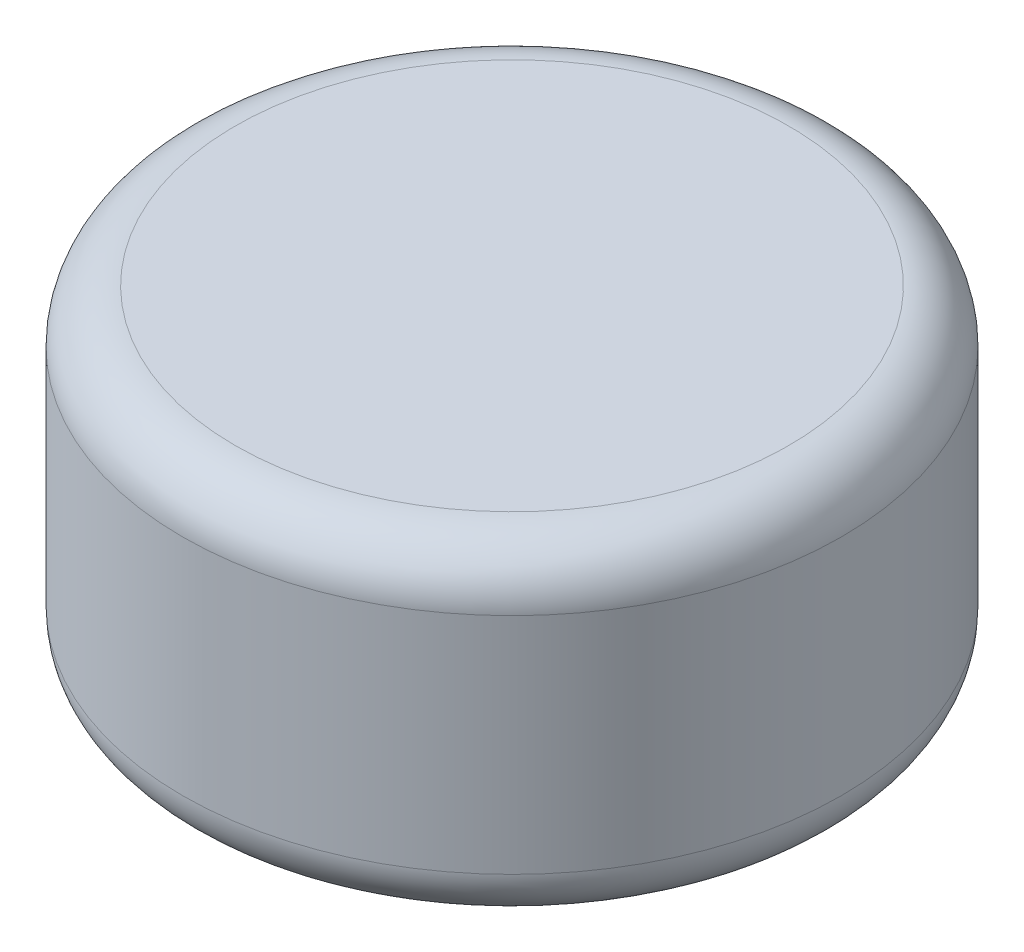
ISO-10303-21;
HEADER;
FILE_DESCRIPTION(('STEP AP214'),'2;1');
FILE_NAME('part.step','',(''),(''),'','','');
FILE_SCHEMA(('AUTOMOTIVE_DESIGN { 1 0 10303 214 1 1 1 1 }'));
ENDSEC;
DATA;
#1=APPLICATION_CONTEXT('core data for automotive mechanical design processes');
#2=APPLICATION_PROTOCOL_DEFINITION('international standard','automotive_design',2000,#1);
#3=PRODUCT_CONTEXT('',#1,'mechanical');
#4=PRODUCT('Part','Part','',(#3));
#5=PRODUCT_RELATED_PRODUCT_CATEGORY('part','',(#4));
#6=PRODUCT_DEFINITION_FORMATION('','',#4);
#7=PRODUCT_DEFINITION_CONTEXT('part definition',#1,'design');
#8=PRODUCT_DEFINITION('design','',#6,#7);
#9=PRODUCT_DEFINITION_SHAPE('','',#8);
#10=(LENGTH_UNIT() NAMED_UNIT(*) SI_UNIT(.MILLI.,.METRE.));
#11=(NAMED_UNIT(*) PLANE_ANGLE_UNIT() SI_UNIT($,.RADIAN.));
#12=(NAMED_UNIT(*) SI_UNIT($,.STERADIAN.) SOLID_ANGLE_UNIT());
#13=UNCERTAINTY_MEASURE_WITH_UNIT(LENGTH_MEASURE(1.E-05),#10,'distance_accuracy_value','');
#14=(GEOMETRIC_REPRESENTATION_CONTEXT(3) GLOBAL_UNCERTAINTY_ASSIGNED_CONTEXT((#13)) GLOBAL_UNIT_ASSIGNED_CONTEXT((#10,
#11,#12)) REPRESENTATION_CONTEXT('',''));
#15=CARTESIAN_POINT('',(0.,0.,0.));
#16=DIRECTION('',(0.,0.,1.));
#17=DIRECTION('',(1.,0.,0.));
#18=AXIS2_PLACEMENT_3D('',#15,#16,#17);
#19=CARTESIAN_POINT('',(0.,1.5875,0.));
#20=DIRECTION('',(0.,-1.,0.));
#21=DIRECTION('',(0.,0.,-1.));
#22=AXIS2_PLACEMENT_3D('',#19,#20,#21);
#23=CYLINDRICAL_SURFACE('',#22,1.5875);
#24=CARTESIAN_POINT('',(0.,0.254,0.));
#25=DIRECTION('',(0.,1.,0.));
#26=DIRECTION('',(0.,0.,1.));
#27=AXIS2_PLACEMENT_3D('',#24,#25,#26);
#28=CIRCLE('',#27,1.5875);
#29=CARTESIAN_POINT('',(0.,0.254,1.5875));
#30=VERTEX_POINT('',#29);
#31=EDGE_CURVE('E42',#30,#30,#28,.T.);
#32=ORIENTED_EDGE('',*,*,#31,.T.);
#33=EDGE_LOOP('',(#32));
#34=FACE_BOUND('',#33,.T.);
#35=CARTESIAN_POINT('',(0.,1.3335,0.));
#36=DIRECTION('',(0.,1.,0.));
#37=DIRECTION('',(0.,0.,1.));
#38=AXIS2_PLACEMENT_3D('',#35,#36,#37);
#39=CIRCLE('',#38,1.5875);
#40=CARTESIAN_POINT('',(0.,1.3335,1.5875));
#41=VERTEX_POINT('',#40);
#42=EDGE_CURVE('E46',#41,#41,#39,.F.);
#43=ORIENTED_EDGE('',*,*,#42,.T.);
#44=EDGE_LOOP('',(#43));
#45=FACE_BOUND('',#44,.T.);
#46=ADVANCED_FACE('F31',(#34,#45),#23,.T.);
#47=CARTESIAN_POINT('',(0.,1.5875,0.));
#48=DIRECTION('',(0.,1.,0.));
#49=DIRECTION('',(0.,0.,1.));
#50=AXIS2_PLACEMENT_3D('',#47,#48,#49);
#51=PLANE('',#50);
#52=CARTESIAN_POINT('',(0.,1.5875,0.));
#53=DIRECTION('',(0.,1.,0.));
#54=DIRECTION('',(0.,0.,1.));
#55=AXIS2_PLACEMENT_3D('',#52,#53,#54);
#56=CIRCLE('',#55,1.3335);
#57=CARTESIAN_POINT('',(0.,1.5875,1.3335));
#58=VERTEX_POINT('',#57);
#59=EDGE_CURVE('E10',#58,#58,#56,.T.);
#60=ORIENTED_EDGE('',*,*,#59,.T.);
#61=EDGE_LOOP('',(#60));
#62=FACE_BOUND('',#61,.T.);
#63=ADVANCED_FACE('F62',(#62),#51,.T.);
#64=CARTESIAN_POINT('',(0.,0.,0.));
#65=DIRECTION('',(0.,1.,0.));
#66=DIRECTION('',(0.,0.,1.));
#67=AXIS2_PLACEMENT_3D('',#64,#65,#66);
#68=PLANE('',#67);
#69=CARTESIAN_POINT('',(0.,0.,0.));
#70=DIRECTION('',(0.,1.,0.));
#71=DIRECTION('',(0.,0.,1.));
#72=AXIS2_PLACEMENT_3D('',#69,#70,#71);
#73=CIRCLE('',#72,1.3335);
#74=CARTESIAN_POINT('',(0.,0.,1.3335));
#75=VERTEX_POINT('',#74);
#76=EDGE_CURVE('E38',#75,#75,#73,.F.);
#77=ORIENTED_EDGE('',*,*,#76,.T.);
#78=EDGE_LOOP('',(#77));
#79=FACE_BOUND('',#78,.T.);
#80=ADVANCED_FACE('F59',(#79),#68,.F.);
#81=CARTESIAN_POINT('',(0.,0.254,0.));
#82=DIRECTION('',(0.,1.,0.));
#83=DIRECTION('',(0.,0.,1.));
#84=AXIS2_PLACEMENT_3D('',#81,#82,#83);
#85=TOROIDAL_SURFACE('',#84,1.3335,0.254);
#86=ORIENTED_EDGE('',*,*,#76,.F.);
#87=EDGE_LOOP('',(#86));
#88=FACE_BOUND('',#87,.T.);
#89=ORIENTED_EDGE('',*,*,#31,.F.);
#90=EDGE_LOOP('',(#89));
#91=FACE_BOUND('',#90,.T.);
#92=ADVANCED_FACE('F55',(#88,#91),#85,.T.);
#93=CARTESIAN_POINT('',(0.,1.3335,0.));
#94=DIRECTION('',(0.,1.,0.));
#95=DIRECTION('',(0.,0.,1.));
#96=AXIS2_PLACEMENT_3D('',#93,#94,#95);
#97=TOROIDAL_SURFACE('',#96,1.3335,0.254);
#98=ORIENTED_EDGE('',*,*,#42,.F.);
#99=EDGE_LOOP('',(#98));
#100=FACE_BOUND('',#99,.T.);
#101=ORIENTED_EDGE('',*,*,#59,.F.);
#102=EDGE_LOOP('',(#101));
#103=FACE_BOUND('',#102,.T.);
#104=ADVANCED_FACE('F33',(#100,#103),#97,.T.);
#105=CLOSED_SHELL('',(#46,#63,#80,#92,#104));
#106=MANIFOLD_SOLID_BREP('B2',#105);
#107=ADVANCED_BREP_SHAPE_REPRESENTATION('',(#18,#106),#14);
#108=SHAPE_DEFINITION_REPRESENTATION(#9,#107);
ENDSEC;
END-ISO-10303-21;
